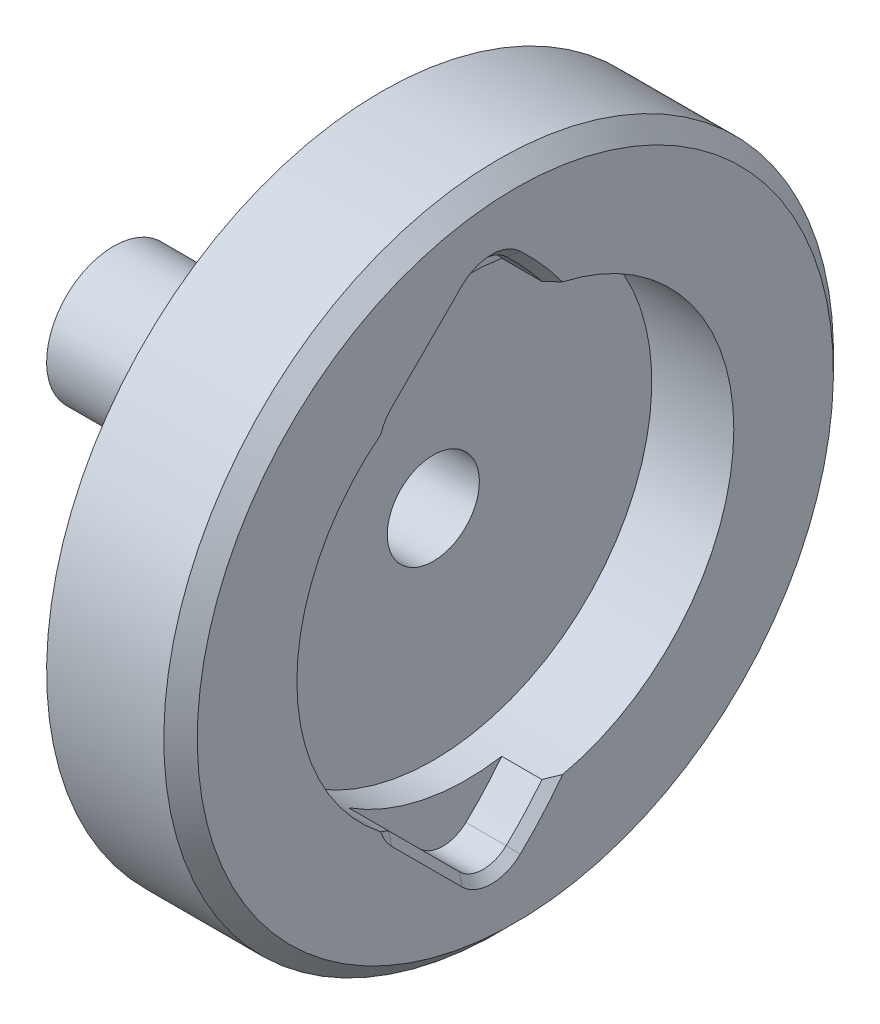
ISO-10303-21;
HEADER;
FILE_DESCRIPTION(('STEP AP214'),'2;1');
FILE_NAME('part.step','',(''),(''),'','','');
FILE_SCHEMA(('AUTOMOTIVE_DESIGN { 1 0 10303 214 1 1 1 1 }'));
ENDSEC;
DATA;
#1=APPLICATION_CONTEXT('core data for automotive mechanical design processes');
#2=APPLICATION_PROTOCOL_DEFINITION('international standard','automotive_design',2000,#1);
#3=PRODUCT_CONTEXT('',#1,'mechanical');
#4=PRODUCT('Part','Part','',(#3));
#5=PRODUCT_RELATED_PRODUCT_CATEGORY('part','',(#4));
#6=PRODUCT_DEFINITION_FORMATION('','',#4);
#7=PRODUCT_DEFINITION_CONTEXT('part definition',#1,'design');
#8=PRODUCT_DEFINITION('design','',#6,#7);
#9=PRODUCT_DEFINITION_SHAPE('','',#8);
#10=(LENGTH_UNIT() NAMED_UNIT(*) SI_UNIT(.MILLI.,.METRE.));
#11=(NAMED_UNIT(*) PLANE_ANGLE_UNIT() SI_UNIT($,.RADIAN.));
#12=(NAMED_UNIT(*) SI_UNIT($,.STERADIAN.) SOLID_ANGLE_UNIT());
#13=UNCERTAINTY_MEASURE_WITH_UNIT(LENGTH_MEASURE(1.E-05),#10,'distance_accuracy_value','');
#14=(GEOMETRIC_REPRESENTATION_CONTEXT(3) GLOBAL_UNCERTAINTY_ASSIGNED_CONTEXT((#13)) GLOBAL_UNIT_ASSIGNED_CONTEXT((#10,
#11,#12)) REPRESENTATION_CONTEXT('',''));
#15=CARTESIAN_POINT('',(0.,0.,0.));
#16=DIRECTION('',(0.,0.,1.));
#17=DIRECTION('',(1.,0.,0.));
#18=AXIS2_PLACEMENT_3D('',#15,#16,#17);
#19=CARTESIAN_POINT('',(5.1,0.,14.4333184705237));
#20=DIRECTION('',(1.,0.,0.));
#21=DIRECTION('',(0.,1.,0.));
#22=AXIS2_PLACEMENT_3D('',#19,#20,#21);
#23=CYLINDRICAL_SURFACE('',#22,20.95);
#24=CARTESIAN_POINT('',(5.1,0.,14.4333184705237));
#25=DIRECTION('',(1.,0.,0.));
#26=DIRECTION('',(0.,-1.,0.));
#27=AXIS2_PLACEMENT_3D('',#24,#25,#26);
#28=CIRCLE('',#27,20.95);
#29=CARTESIAN_POINT('',(5.1,12.8818445804651,-2.08820023099825));
#30=VERTEX_POINT('',#29);
#31=CARTESIAN_POINT('',(5.1,15.2342488146704,0.0520750245377594));
#32=VERTEX_POINT('',#31);
#33=EDGE_CURVE('E434',#30,#32,#28,.T.);
#34=ORIENTED_EDGE('',*,*,#33,.F.);
#35=DIRECTION('',(1.,0.,0.));
#36=VECTOR('',#35,1.);
#37=CARTESIAN_POINT('',(5.55,12.8818445804651,-2.08820023099825));
#38=LINE('',#37,#36);
#39=CARTESIAN_POINT('',(7.5,12.8818445804651,-2.08820023099825));
#40=VERTEX_POINT('',#39);
#41=EDGE_CURVE('E452',#30,#40,#38,.T.);
#42=ORIENTED_EDGE('',*,*,#41,.T.);
#43=CARTESIAN_POINT('',(7.50000000000001,0.,14.4333184705237));
#44=DIRECTION('',(1.,0.,0.));
#45=DIRECTION('',(0.,1.,0.));
#46=AXIS2_PLACEMENT_3D('',#43,#44,#45);
#47=CIRCLE('',#46,20.95);
#48=CARTESIAN_POINT('',(7.5,15.2342488146704,0.0520750245377594));
#49=VERTEX_POINT('',#48);
#50=EDGE_CURVE('E77',#40,#49,#47,.T.);
#51=ORIENTED_EDGE('',*,*,#50,.T.);
#52=DIRECTION('',(1.,0.,0.));
#53=VECTOR('',#52,1.);
#54=CARTESIAN_POINT('',(5.1,15.2342488146704,0.0520750245377594));
#55=LINE('',#54,#53);
#56=EDGE_CURVE('E393',#32,#49,#55,.T.);
#57=ORIENTED_EDGE('',*,*,#56,.F.);
#58=EDGE_LOOP('',(#34,#42,#51,#57));
#59=FACE_BOUND('',#58,.T.);
#60=ADVANCED_FACE('F49',(#59),#23,.F.);
#61=CARTESIAN_POINT('',(5.1,-13.7799052524107,1.42498609336697));
#62=DIRECTION('',(-1.,0.,0.));
#63=DIRECTION('',(0.,-1.,0.));
#64=AXIS2_PLACEMENT_3D('',#61,#62,#63);
#65=PLANE('',#64);
#66=CARTESIAN_POINT('',(5.1,9.57007567656878,5.63481566920882));
#67=DIRECTION('',(1.,0.,0.));
#68=DIRECTION('',(0.,-1.,0.));
#69=AXIS2_PLACEMENT_3D('',#66,#67,#68);
#70=CIRCLE('',#69,2.);
#71=CARTESIAN_POINT('',(5.1,10.9842892389419,7.04902923158192));
#72=VERTEX_POINT('',#71);
#73=CARTESIAN_POINT('',(5.1,10.9791166761917,7.05418294422313));
#74=VERTEX_POINT('',#73);
#75=EDGE_CURVE('E416',#72,#74,#70,.T.);
#76=ORIENTED_EDGE('',*,*,#75,.T.);
#77=CARTESIAN_POINT('',(5.1,0.,0.));
#78=DIRECTION('',(-1.,0.,0.));
#79=DIRECTION('',(0.,-1.,0.));
#80=AXIS2_PLACEMENT_3D('',#77,#78,#79);
#81=CIRCLE('',#80,13.05);
#82=EDGE_CURVE('E454',#74,#30,#81,.T.);
#83=ORIENTED_EDGE('',*,*,#82,.T.);
#84=ORIENTED_EDGE('',*,*,#33,.T.);
#85=CARTESIAN_POINT('',(5.1,13.7799052524107,1.42498609336697));
#86=DIRECTION('',(1.,0.,0.));
#87=DIRECTION('',(0.,1.,0.));
#88=AXIS2_PLACEMENT_3D('',#85,#86,#87);
#89=CIRCLE('',#88,2.);
#90=CARTESIAN_POINT('',(5.1,15.1941188147837,2.83919965574006));
#91=VERTEX_POINT('',#90);
#92=EDGE_CURVE('E426',#32,#91,#89,.T.);
#93=ORIENTED_EDGE('',*,*,#92,.T.);
#94=DIRECTION('',(0.,-0.707106781186549,0.707106781186546));
#95=VECTOR('',#94,1.);
#96=CARTESIAN_POINT('',(5.1,15.1941188147837,2.83919965574006));
#97=LINE('',#96,#95);
#98=EDGE_CURVE('E425',#91,#72,#97,.T.);
#99=ORIENTED_EDGE('',*,*,#98,.T.);
#100=EDGE_LOOP('',(#76,#83,#84,#93,#99));
#101=FACE_BOUND('',#100,.T.);
#102=ADVANCED_FACE('F312',(#101),#65,.F.);
#103=CARTESIAN_POINT('',(7.50000000000001,0.,14.4333184705237));
#104=DIRECTION('',(1.,0.,0.));
#105=DIRECTION('',(0.,1.,0.));
#106=AXIS2_PLACEMENT_3D('',#103,#104,#105);
#107=CONICAL_SURFACE('',#106,20.95,0.785398163397452);
#108=CARTESIAN_POINT('',(8.00019999999989,12.7410236271187,-2.82290930304251));
#109=CARTESIAN_POINT('',(7.91779692338126,12.7681402984375,-2.70042803403494));
#110=CARTESIAN_POINT('',(7.83489537836345,12.7934376363972,-2.57793744219343));
#111=CARTESIAN_POINT('',(7.66809537804651,12.8403936381337,-2.33293765179135));
#112=CARTESIAN_POINT('',(7.58419692306435,12.8620523030674,-2.2104284532367));
#113=CARTESIAN_POINT('',(7.4998,12.8818916357989,-2.08790993185405));
#114=B_SPLINE_CURVE_WITH_KNOTS('',3,(#108,#109,#110,#111,#112,#113),.UNSPECIFIED.,.F.,.F.,(4,2,
4),(0.,0.450165635155379,0.900331127180728),.UNSPECIFIED.);
#115=CARTESIAN_POINT('',(8.,12.7410894780223,-2.8226120727136));
#116=VERTEX_POINT('',#115);
#117=EDGE_CURVE('E444',#116,#40,#114,.T.);
#118=ORIENTED_EDGE('',*,*,#117,.F.);
#119=CARTESIAN_POINT('',(8.,0.,14.4333184705237));
#120=DIRECTION('',(1.,0.,0.));
#121=DIRECTION('',(0.,1.,0.));
#122=AXIS2_PLACEMENT_3D('',#119,#120,#121);
#123=CIRCLE('',#122,21.45);
#124=CARTESIAN_POINT('',(8.,15.5978347052353,-0.291152742669542));
#125=VERTEX_POINT('',#124);
#126=EDGE_CURVE('E358',#125,#116,#123,.F.);
#127=ORIENTED_EDGE('',*,*,#126,.F.);
#128=DIRECTION('',(0.707106781186545,0.514188097524421,-0.485397363367602));
#129=VECTOR('',#128,1.);
#130=CARTESIAN_POINT('',(7.5,15.2342488146704,0.05207502453776));
#131=LINE('',#130,#129);
#132=EDGE_CURVE('E240',#49,#125,#131,.T.);
#133=ORIENTED_EDGE('',*,*,#132,.F.);
#134=ORIENTED_EDGE('',*,*,#50,.F.);
#135=EDGE_LOOP('',(#118,#127,#133,#134));
#136=FACE_BOUND('',#135,.T.);
#137=ADVANCED_FACE('F311',(#136),#107,.F.);
#138=CARTESIAN_POINT('',(-16.,0.,0.));
#139=DIRECTION('',(-1.,0.,0.));
#140=DIRECTION('',(0.,-1.,0.));
#141=AXIS2_PLACEMENT_3D('',#138,#139,#140);
#142=PLANE('',#141);
#143=CARTESIAN_POINT('',(-16.,0.,0.));
#144=DIRECTION('',(-1.,0.,0.));
#145=DIRECTION('',(0.,-1.,0.));
#146=AXIS2_PLACEMENT_3D('',#143,#144,#145);
#147=CIRCLE('',#146,1.75);
#148=CARTESIAN_POINT('',(-16.,-1.75,0.));
#149=VERTEX_POINT('',#148);
#150=EDGE_CURVE('E376',#149,#149,#147,.T.);
#151=ORIENTED_EDGE('',*,*,#150,.F.);
#152=EDGE_LOOP('',(#151));
#153=FACE_BOUND('',#152,.T.);
#154=CARTESIAN_POINT('',(-16.,0.,0.));
#155=DIRECTION('',(1.,0.,0.));
#156=DIRECTION('',(0.,1.,0.));
#157=AXIS2_PLACEMENT_3D('',#154,#155,#156);
#158=CIRCLE('',#157,4.);
#159=CARTESIAN_POINT('',(-16.,4.,0.));
#160=VERTEX_POINT('',#159);
#161=EDGE_CURVE('E381',#160,#160,#158,.T.);
#162=ORIENTED_EDGE('',*,*,#161,.F.);
#163=EDGE_LOOP('',(#162));
#164=FACE_BOUND('',#163,.T.);
#165=ADVANCED_FACE('F531',(#153,#164),#142,.T.);
#166=CARTESIAN_POINT('',(8.,0.,0.));
#167=DIRECTION('',(1.,0.,0.));
#168=DIRECTION('',(0.,1.,0.));
#169=AXIS2_PLACEMENT_3D('',#166,#167,#168);
#170=CYLINDRICAL_SURFACE('',#169,4.);
#171=CARTESIAN_POINT('',(-10.,0.,0.));
#172=DIRECTION('',(-1.,0.,0.));
#173=DIRECTION('',(0.,-1.,0.));
#174=AXIS2_PLACEMENT_3D('',#171,#172,#173);
#175=CIRCLE('',#174,4.);
#176=CARTESIAN_POINT('',(-10.,-4.,0.));
#177=VERTEX_POINT('',#176);
#178=EDGE_CURVE('E371',#177,#177,#175,.T.);
#179=ORIENTED_EDGE('',*,*,#178,.T.);
#180=EDGE_LOOP('',(#179));
#181=FACE_BOUND('',#180,.T.);
#182=ORIENTED_EDGE('',*,*,#161,.T.);
#183=EDGE_LOOP('',(#182));
#184=FACE_BOUND('',#183,.T.);
#185=ADVANCED_FACE('F537',(#181,#184),#170,.T.);
#186=CARTESIAN_POINT('',(0.,4.,0.));
#187=DIRECTION('',(-1.,0.,0.));
#188=DIRECTION('',(0.,-1.,0.));
#189=AXIS2_PLACEMENT_3D('',#186,#187,#188);
#190=PLANE('',#189);
#191=CARTESIAN_POINT('',(0.,0.,0.));
#192=DIRECTION('',(-1.,0.,0.));
#193=DIRECTION('',(0.,-1.,0.));
#194=AXIS2_PLACEMENT_3D('',#191,#192,#193);
#195=CIRCLE('',#194,14.);
#196=CARTESIAN_POINT('',(0.,-14.,0.));
#197=VERTEX_POINT('',#196);
#198=EDGE_CURVE('E379',#197,#197,#195,.F.);
#199=ORIENTED_EDGE('',*,*,#198,.T.);
#200=EDGE_LOOP('',(#199));
#201=FACE_BOUND('',#200,.T.);
#202=CARTESIAN_POINT('',(0.,0.,0.));
#203=DIRECTION('',(1.,0.,0.));
#204=DIRECTION('',(0.,1.,0.));
#205=AXIS2_PLACEMENT_3D('',#202,#203,#204);
#206=CIRCLE('',#205,20.);
#207=CARTESIAN_POINT('',(0.,20.,0.));
#208=VERTEX_POINT('',#207);
#209=EDGE_CURVE('E389',#208,#208,#206,.T.);
#210=ORIENTED_EDGE('',*,*,#209,.F.);
#211=EDGE_LOOP('',(#210));
#212=FACE_BOUND('',#211,.T.);
#213=ADVANCED_FACE('F542',(#201,#212),#190,.T.);
#214=CARTESIAN_POINT('',(8.,0.,0.));
#215=DIRECTION('',(1.,0.,0.));
#216=DIRECTION('',(0.,1.,0.));
#217=AXIS2_PLACEMENT_3D('',#214,#215,#216);
#218=CYLINDRICAL_SURFACE('',#217,20.);
#219=CARTESIAN_POINT('',(7.00000000000004,0.,0.));
#220=DIRECTION('',(1.,0.,0.));
#221=DIRECTION('',(0.,1.,0.));
#222=AXIS2_PLACEMENT_3D('',#219,#220,#221);
#223=CIRCLE('',#222,20.);
#224=CARTESIAN_POINT('',(7.00000000000003,20.,0.));
#225=VERTEX_POINT('',#224);
#226=EDGE_CURVE('E361',#225,#225,#223,.F.);
#227=ORIENTED_EDGE('',*,*,#226,.T.);
#228=EDGE_LOOP('',(#227));
#229=FACE_BOUND('',#228,.T.);
#230=ORIENTED_EDGE('',*,*,#209,.T.);
#231=EDGE_LOOP('',(#230));
#232=FACE_BOUND('',#231,.T.);
#233=ADVANCED_FACE('F549',(#229,#232),#218,.T.);
#234=CARTESIAN_POINT('',(8.,20.,0.));
#235=DIRECTION('',(1.,0.,0.));
#236=DIRECTION('',(0.,1.,0.));
#237=AXIS2_PLACEMENT_3D('',#234,#235,#236);
#238=PLANE('',#237);
#239=CARTESIAN_POINT('',(8.,0.,0.));
#240=DIRECTION('',(1.,0.,0.));
#241=DIRECTION('',(0.,1.,0.));
#242=AXIS2_PLACEMENT_3D('',#239,#240,#241);
#243=CIRCLE('',#242,13.05);
#244=CARTESIAN_POINT('',(8.,10.2871401538683,8.02977256556316));
#245=VERTEX_POINT('',#244);
#246=CARTESIAN_POINT('',(8.,-10.2871401538683,8.02977256556316));
#247=VERTEX_POINT('',#246);
#248=EDGE_CURVE('E70',#245,#247,#243,.T.);
#249=ORIENTED_EDGE('',*,*,#248,.F.);
#250=CARTESIAN_POINT('',(8.,9.57007567656878,5.63481566920882));
#251=DIRECTION('',(1.,0.,0.));
#252=DIRECTION('',(0.,1.,0.));
#253=AXIS2_PLACEMENT_3D('',#250,#251,#252);
#254=CIRCLE('',#253,2.5);
#255=CARTESIAN_POINT('',(8.,11.3378426295351,7.4025826221752));
#256=VERTEX_POINT('',#255);
#257=EDGE_CURVE('E176',#245,#256,#254,.F.);
#258=ORIENTED_EDGE('',*,*,#257,.T.);
#259=DIRECTION('',(0.,0.707106781186549,-0.707106781186546));
#260=VECTOR('',#259,1.);
#261=CARTESIAN_POINT('',(8.,15.547672205377,3.19275304633334));
#262=LINE('',#261,#260);
#263=CARTESIAN_POINT('',(8.,15.547672205377,3.19275304633334));
#264=VERTEX_POINT('',#263);
#265=EDGE_CURVE('E193',#256,#264,#262,.T.);
#266=ORIENTED_EDGE('',*,*,#265,.T.);
#267=CARTESIAN_POINT('',(8.,13.7799052524107,1.42498609336697));
#268=DIRECTION('',(1.,0.,0.));
#269=DIRECTION('',(0.,1.,0.));
#270=AXIS2_PLACEMENT_3D('',#267,#268,#269);
#271=CIRCLE('',#270,2.5);
#272=EDGE_CURVE('E354',#264,#125,#271,.F.);
#273=ORIENTED_EDGE('',*,*,#272,.T.);
#274=ORIENTED_EDGE('',*,*,#126,.T.);
#275=CARTESIAN_POINT('',(8.,-12.7410894780224,-2.8226120727135));
#276=VERTEX_POINT('',#275);
#277=EDGE_CURVE('E185',#276,#116,#243,.T.);
#278=ORIENTED_EDGE('',*,*,#277,.F.);
#279=CARTESIAN_POINT('',(8.,-15.5978347052353,-0.291152742669548));
#280=VERTEX_POINT('',#279);
#281=EDGE_CURVE('E365',#276,#280,#123,.F.);
#282=ORIENTED_EDGE('',*,*,#281,.T.);
#283=CARTESIAN_POINT('',(8.,-13.7799052524107,1.42498609336697));
#284=DIRECTION('',(1.,0.,0.));
#285=DIRECTION('',(0.,1.,0.));
#286=AXIS2_PLACEMENT_3D('',#283,#284,#285);
#287=CIRCLE('',#286,2.5);
#288=CARTESIAN_POINT('',(8.,-15.547672205377,3.19275304633334));
#289=VERTEX_POINT('',#288);
#290=EDGE_CURVE('E346',#280,#289,#287,.F.);
#291=ORIENTED_EDGE('',*,*,#290,.T.);
#292=DIRECTION('',(0.,0.707106781186549,0.707106781186546));
#293=VECTOR('',#292,1.);
#294=CARTESIAN_POINT('',(8.,-11.3378426295351,7.40258262217519));
#295=LINE('',#294,#293);
#296=CARTESIAN_POINT('',(8.,-11.3378426295351,7.40258262217519));
#297=VERTEX_POINT('',#296);
#298=EDGE_CURVE('E186',#289,#297,#295,.T.);
#299=ORIENTED_EDGE('',*,*,#298,.T.);
#300=CARTESIAN_POINT('',(8.,-9.57007567656878,5.63481566920882));
#301=DIRECTION('',(1.,0.,0.));
#302=DIRECTION('',(0.,1.,0.));
#303=AXIS2_PLACEMENT_3D('',#300,#301,#302);
#304=CIRCLE('',#303,2.5);
#305=EDGE_CURVE('E177',#297,#247,#304,.F.);
#306=ORIENTED_EDGE('',*,*,#305,.T.);
#307=EDGE_LOOP('',(#249,#258,#266,#273,#274,#278,#282,#291,#299,#306));
#308=FACE_BOUND('',#307,.T.);
#309=CARTESIAN_POINT('',(8.,0.,0.));
#310=DIRECTION('',(1.,0.,0.));
#311=DIRECTION('',(0.,1.,0.));
#312=AXIS2_PLACEMENT_3D('',#309,#310,#311);
#313=CIRCLE('',#312,19.);
#314=CARTESIAN_POINT('',(8.,19.,0.));
#315=VERTEX_POINT('',#314);
#316=EDGE_CURVE('E370',#315,#315,#313,.T.);
#317=ORIENTED_EDGE('',*,*,#316,.T.);
#318=EDGE_LOOP('',(#317));
#319=FACE_BOUND('',#318,.T.);
#320=ADVANCED_FACE('F172',(#308,#319),#238,.T.);
#321=CARTESIAN_POINT('',(5.1,-13.7799052524107,1.42498609336697));
#322=DIRECTION('',(1.,0.,0.));
#323=DIRECTION('',(0.,1.,0.));
#324=AXIS2_PLACEMENT_3D('',#321,#322,#323);
#325=CYLINDRICAL_SURFACE('',#324,2.);
#326=DIRECTION('',(1.,0.,0.));
#327=VECTOR('',#326,1.);
#328=CARTESIAN_POINT('',(5.1,-15.1941188147837,2.83919965574006));
#329=LINE('',#328,#327);
#330=CARTESIAN_POINT('',(5.1,-15.1941188147837,2.83919965574006));
#331=VERTEX_POINT('',#330);
#332=CARTESIAN_POINT('',(7.50000000000001,-15.1941188147837,2.83919965574006));
#333=VERTEX_POINT('',#332);
#334=EDGE_CURVE('E394',#331,#333,#329,.T.);
#335=ORIENTED_EDGE('',*,*,#334,.T.);
#336=CARTESIAN_POINT('',(7.50000000000001,-13.7799052524107,1.42498609336697));
#337=DIRECTION('',(1.,0.,0.));
#338=DIRECTION('',(0.,0.,-1.));
#339=AXIS2_PLACEMENT_3D('',#336,#337,#338);
#340=CIRCLE('',#339,2.);
#341=CARTESIAN_POINT('',(7.50000000000001,-15.2342488146704,0.0520750245377542));
#342=VERTEX_POINT('',#341);
#343=EDGE_CURVE('E208',#333,#342,#340,.T.);
#344=ORIENTED_EDGE('',*,*,#343,.T.);
#345=DIRECTION('',(1.,0.,0.));
#346=VECTOR('',#345,1.);
#347=CARTESIAN_POINT('',(5.1,-15.2342488146704,0.0520750245377542));
#348=LINE('',#347,#346);
#349=CARTESIAN_POINT('',(5.1,-15.2342488146704,0.0520750245377542));
#350=VERTEX_POINT('',#349);
#351=EDGE_CURVE('E345',#350,#342,#348,.T.);
#352=ORIENTED_EDGE('',*,*,#351,.F.);
#353=CARTESIAN_POINT('',(5.1,-13.7799052524107,1.42498609336697));
#354=DIRECTION('',(1.,0.,0.));
#355=DIRECTION('',(0.,-1.,0.));
#356=AXIS2_PLACEMENT_3D('',#353,#354,#355);
#357=CIRCLE('',#356,2.);
#358=EDGE_CURVE('E436',#331,#350,#357,.T.);
#359=ORIENTED_EDGE('',*,*,#358,.F.);
#360=EDGE_LOOP('',(#335,#344,#352,#359));
#361=FACE_BOUND('',#360,.T.);
#362=ADVANCED_FACE('F509',(#361),#325,.F.);
#363=CARTESIAN_POINT('',(5.1,-10.9842892389419,7.04902923158192));
#364=DIRECTION('',(0.,-0.707106781186546,0.707106781186549));
#365=DIRECTION('',(0.,-0.707106781186549,-0.707106781186546));
#366=AXIS2_PLACEMENT_3D('',#363,#364,#365);
#367=PLANE('',#366);
#368=DIRECTION('',(1.,0.,0.));
#369=VECTOR('',#368,1.);
#370=CARTESIAN_POINT('',(5.1,-10.9842892389419,7.04902923158192));
#371=LINE('',#370,#369);
#372=CARTESIAN_POINT('',(5.1,-10.9842892389419,7.04902923158192));
#373=VERTEX_POINT('',#372);
#374=CARTESIAN_POINT('',(7.50000000000001,-10.9842892389419,7.04902923158192));
#375=VERTEX_POINT('',#374);
#376=EDGE_CURVE('E410',#373,#375,#371,.T.);
#377=ORIENTED_EDGE('',*,*,#376,.T.);
#378=DIRECTION('',(0.,-0.707106781186549,-0.707106781186546));
#379=VECTOR('',#378,1.);
#380=CARTESIAN_POINT('',(7.50000000000001,-15.1941188147837,2.83919965574006));
#381=LINE('',#380,#379);
#382=EDGE_CURVE('E205',#375,#333,#381,.T.);
#383=ORIENTED_EDGE('',*,*,#382,.T.);
#384=ORIENTED_EDGE('',*,*,#334,.F.);
#385=DIRECTION('',(0.,-0.707106781186549,-0.707106781186546));
#386=VECTOR('',#385,1.);
#387=CARTESIAN_POINT('',(5.1,-10.9842892389419,7.04902923158192));
#388=LINE('',#387,#386);
#389=EDGE_CURVE('E398',#373,#331,#388,.T.);
#390=ORIENTED_EDGE('',*,*,#389,.F.);
#391=EDGE_LOOP('',(#377,#383,#384,#390));
#392=FACE_BOUND('',#391,.T.);
#393=ADVANCED_FACE('F506',(#392),#367,.F.);
#394=CARTESIAN_POINT('',(5.1,-9.57007567656878,5.63481566920882));
#395=DIRECTION('',(1.,0.,0.));
#396=DIRECTION('',(0.,1.,0.));
#397=AXIS2_PLACEMENT_3D('',#394,#395,#396);
#398=CYLINDRICAL_SURFACE('',#397,2.);
#399=CARTESIAN_POINT('',(5.1,-9.57007567656878,5.63481566920882));
#400=DIRECTION('',(1.,0.,0.));
#401=DIRECTION('',(0.,1.,0.));
#402=AXIS2_PLACEMENT_3D('',#399,#400,#401);
#403=CIRCLE('',#402,2.);
#404=CARTESIAN_POINT('',(5.1,-10.9791166761917,7.05418294422313));
#405=VERTEX_POINT('',#404);
#406=EDGE_CURVE('E419',#405,#373,#403,.T.);
#407=ORIENTED_EDGE('',*,*,#406,.F.);
#408=DIRECTION('',(1.,0.,0.));
#409=VECTOR('',#408,1.);
#410=CARTESIAN_POINT('',(5.55000000000001,-10.9791166761917,7.05418294422313));
#411=LINE('',#410,#409);
#412=CARTESIAN_POINT('',(7.50000000000001,-10.9791166761917,7.05418294422315));
#413=VERTEX_POINT('',#412);
#414=EDGE_CURVE('E464',#405,#413,#411,.T.);
#415=ORIENTED_EDGE('',*,*,#414,.T.);
#416=CARTESIAN_POINT('',(7.50000000000001,-9.57007567656878,5.63481566920882));
#417=DIRECTION('',(1.,0.,0.));
#418=DIRECTION('',(0.,0.,-1.));
#419=AXIS2_PLACEMENT_3D('',#416,#417,#418);
#420=CIRCLE('',#419,2.);
#421=EDGE_CURVE('E194',#413,#375,#420,.T.);
#422=ORIENTED_EDGE('',*,*,#421,.T.);
#423=ORIENTED_EDGE('',*,*,#376,.F.);
#424=EDGE_LOOP('',(#407,#415,#422,#423));
#425=FACE_BOUND('',#424,.T.);
#426=ADVANCED_FACE('F497',(#425),#398,.F.);
#427=CARTESIAN_POINT('',(5.1,9.57007567656878,5.63481566920882));
#428=DIRECTION('',(1.,0.,0.));
#429=DIRECTION('',(0.,1.,0.));
#430=AXIS2_PLACEMENT_3D('',#427,#428,#429);
#431=CYLINDRICAL_SURFACE('',#430,2.);
#432=CARTESIAN_POINT('',(7.5,9.57007567656878,5.63481566920882));
#433=DIRECTION('',(1.,0.,0.));
#434=DIRECTION('',(0.,0.,-1.));
#435=AXIS2_PLACEMENT_3D('',#432,#433,#434);
#436=CIRCLE('',#435,2.);
#437=CARTESIAN_POINT('',(7.5,10.9842892389419,7.04902923158192));
#438=VERTEX_POINT('',#437);
#439=CARTESIAN_POINT('',(7.50000000000001,10.9791166761917,7.05418294422315));
#440=VERTEX_POINT('',#439);
#441=EDGE_CURVE('E203',#438,#440,#436,.T.);
#442=ORIENTED_EDGE('',*,*,#441,.T.);
#443=DIRECTION('',(1.,0.,0.));
#444=VECTOR('',#443,1.);
#445=CARTESIAN_POINT('',(5.55,10.9791166761917,7.05418294422313));
#446=LINE('',#445,#444);
#447=EDGE_CURVE('E165',#440,#74,#446,.F.);
#448=ORIENTED_EDGE('',*,*,#447,.T.);
#449=ORIENTED_EDGE('',*,*,#75,.F.);
#450=DIRECTION('',(1.,0.,0.));
#451=VECTOR('',#450,1.);
#452=CARTESIAN_POINT('',(5.1,10.9842892389419,7.04902923158192));
#453=LINE('',#452,#451);
#454=EDGE_CURVE('E401',#72,#438,#453,.T.);
#455=ORIENTED_EDGE('',*,*,#454,.T.);
#456=EDGE_LOOP('',(#442,#448,#449,#455));
#457=FACE_BOUND('',#456,.T.);
#458=ADVANCED_FACE('F498',(#457),#431,.F.);
#459=CARTESIAN_POINT('',(5.1,15.1941188147837,2.83919965574006));
#460=DIRECTION('',(0.,0.707106781186546,0.707106781186549));
#461=DIRECTION('',(0.,-0.707106781186549,0.707106781186546));
#462=AXIS2_PLACEMENT_3D('',#459,#460,#461);
#463=PLANE('',#462);
#464=DIRECTION('',(1.,0.,0.));
#465=VECTOR('',#464,1.);
#466=CARTESIAN_POINT('',(5.1,15.1941188147837,2.83919965574006));
#467=LINE('',#466,#465);
#468=CARTESIAN_POINT('',(7.5,15.1941188147837,2.83919965574006));
#469=VERTEX_POINT('',#468);
#470=EDGE_CURVE('E400',#91,#469,#467,.T.);
#471=ORIENTED_EDGE('',*,*,#470,.T.);
#472=DIRECTION('',(0.,-0.707106781186549,0.707106781186546));
#473=VECTOR('',#472,1.);
#474=CARTESIAN_POINT('',(7.5,10.9842892389419,7.04902923158192));
#475=LINE('',#474,#473);
#476=EDGE_CURVE('E210',#469,#438,#475,.T.);
#477=ORIENTED_EDGE('',*,*,#476,.T.);
#478=ORIENTED_EDGE('',*,*,#454,.F.);
#479=ORIENTED_EDGE('',*,*,#98,.F.);
#480=EDGE_LOOP('',(#471,#477,#478,#479));
#481=FACE_BOUND('',#480,.T.);
#482=ADVANCED_FACE('F335',(#481),#463,.F.);
#483=CARTESIAN_POINT('',(5.1,13.7799052524107,1.42498609336697));
#484=DIRECTION('',(1.,0.,0.));
#485=DIRECTION('',(0.,1.,0.));
#486=AXIS2_PLACEMENT_3D('',#483,#484,#485);
#487=CYLINDRICAL_SURFACE('',#486,2.);
#488=ORIENTED_EDGE('',*,*,#56,.T.);
#489=CARTESIAN_POINT('',(7.5,13.7799052524107,1.42498609336697));
#490=DIRECTION('',(1.,0.,0.));
#491=DIRECTION('',(0.,0.,-1.));
#492=AXIS2_PLACEMENT_3D('',#489,#490,#491);
#493=CIRCLE('',#492,2.);
#494=EDGE_CURVE('E214',#49,#469,#493,.T.);
#495=ORIENTED_EDGE('',*,*,#494,.T.);
#496=ORIENTED_EDGE('',*,*,#470,.F.);
#497=ORIENTED_EDGE('',*,*,#92,.F.);
#498=EDGE_LOOP('',(#488,#495,#496,#497));
#499=FACE_BOUND('',#498,.T.);
#500=ADVANCED_FACE('F327',(#499),#487,.F.);
#501=CARTESIAN_POINT('',(7.50000000000001,-12.8818445804651,-2.08820023099825));
#502=VERTEX_POINT('',#501);
#503=EDGE_CURVE('E65',#342,#502,#47,.T.);
#504=ORIENTED_EDGE('',*,*,#503,.T.);
#505=DIRECTION('',(1.,0.,0.));
#506=VECTOR('',#505,1.);
#507=CARTESIAN_POINT('',(5.55000000000001,-12.8818445804651,-2.08820023099825));
#508=LINE('',#507,#506);
#509=CARTESIAN_POINT('',(5.1,-12.8818445804651,-2.08820023099825));
#510=VERTEX_POINT('',#509);
#511=EDGE_CURVE('E338',#502,#510,#508,.F.);
#512=ORIENTED_EDGE('',*,*,#511,.T.);
#513=EDGE_CURVE('E435',#350,#510,#28,.T.);
#514=ORIENTED_EDGE('',*,*,#513,.F.);
#515=ORIENTED_EDGE('',*,*,#351,.T.);
#516=EDGE_LOOP('',(#504,#512,#514,#515));
#517=FACE_BOUND('',#516,.T.);
#518=ADVANCED_FACE('F314',(#517),#23,.F.);
#519=ORIENTED_EDGE('',*,*,#513,.T.);
#520=EDGE_CURVE('E459',#510,#405,#81,.T.);
#521=ORIENTED_EDGE('',*,*,#520,.T.);
#522=ORIENTED_EDGE('',*,*,#406,.T.);
#523=ORIENTED_EDGE('',*,*,#389,.T.);
#524=ORIENTED_EDGE('',*,*,#358,.T.);
#525=EDGE_LOOP('',(#519,#521,#522,#523,#524));
#526=FACE_BOUND('',#525,.T.);
#527=ADVANCED_FACE('F322',(#526),#65,.F.);
#528=CARTESIAN_POINT('',(-10.,0.,0.));
#529=DIRECTION('',(-1.,0.,0.));
#530=DIRECTION('',(0.,-1.,0.));
#531=AXIS2_PLACEMENT_3D('',#528,#529,#530);
#532=TOROIDAL_SURFACE('',#531,14.,10.);
#533=ORIENTED_EDGE('',*,*,#178,.F.);
#534=EDGE_LOOP('',(#533));
#535=FACE_BOUND('',#534,.T.);
#536=ORIENTED_EDGE('',*,*,#198,.F.);
#537=EDGE_LOOP('',(#536));
#538=FACE_BOUND('',#537,.T.);
#539=ADVANCED_FACE('F334',(#535,#538),#532,.F.);
#540=CARTESIAN_POINT('',(8.001,0.,0.));
#541=DIRECTION('',(-1.,0.,0.));
#542=DIRECTION('',(0.,-1.,0.));
#543=AXIS2_PLACEMENT_3D('',#540,#541,#542);
#544=CYLINDRICAL_SURFACE('',#543,1.75);
#545=CARTESIAN_POINT('',(-13.,0.,0.));
#546=DIRECTION('',(-1.,0.,0.));
#547=DIRECTION('',(0.,-1.,0.));
#548=AXIS2_PLACEMENT_3D('',#545,#546,#547);
#549=CIRCLE('',#548,1.75);
#550=CARTESIAN_POINT('',(-13.,-1.75,0.));
#551=VERTEX_POINT('',#550);
#552=EDGE_CURVE('E375',#551,#551,#549,.F.);
#553=ORIENTED_EDGE('',*,*,#552,.T.);
#554=EDGE_LOOP('',(#553));
#555=FACE_BOUND('',#554,.T.);
#556=ORIENTED_EDGE('',*,*,#150,.T.);
#557=EDGE_LOOP('',(#556));
#558=FACE_BOUND('',#557,.T.);
#559=ADVANCED_FACE('F514',(#555,#558),#544,.F.);
#560=CARTESIAN_POINT('',(-13.,0.,0.));
#561=DIRECTION('',(-1.,0.,0.));
#562=DIRECTION('',(0.,-1.,0.));
#563=AXIS2_PLACEMENT_3D('',#560,#561,#562);
#564=PLANE('',#563);
#565=CARTESIAN_POINT('',(-13.,0.,0.));
#566=DIRECTION('',(-1.,0.,0.));
#567=DIRECTION('',(0.,-1.,0.));
#568=AXIS2_PLACEMENT_3D('',#565,#566,#567);
#569=CIRCLE('',#568,2.75);
#570=CARTESIAN_POINT('',(-13.,-2.75,0.));
#571=VERTEX_POINT('',#570);
#572=EDGE_CURVE('E239',#571,#571,#569,.F.);
#573=ORIENTED_EDGE('',*,*,#572,.T.);
#574=EDGE_LOOP('',(#573));
#575=FACE_BOUND('',#574,.T.);
#576=ORIENTED_EDGE('',*,*,#552,.F.);
#577=EDGE_LOOP('',(#576));
#578=FACE_BOUND('',#577,.T.);
#579=ADVANCED_FACE('F517',(#575,#578),#564,.F.);
#580=CARTESIAN_POINT('',(-23.778174593052,0.,0.));
#581=DIRECTION('',(1.,0.,0.));
#582=DIRECTION('',(0.,1.,0.));
#583=AXIS2_PLACEMENT_3D('',#580,#581,#582);
#584=CYLINDRICAL_SURFACE('',#583,2.75);
#585=CARTESIAN_POINT('',(3.10000000000001,0.,0.));
#586=DIRECTION('',(-1.,0.,0.));
#587=DIRECTION('',(0.,-1.,0.));
#588=AXIS2_PLACEMENT_3D('',#585,#586,#587);
#589=CIRCLE('',#588,2.75);
#590=CARTESIAN_POINT('',(3.10000000000001,-2.75,0.));
#591=VERTEX_POINT('',#590);
#592=EDGE_CURVE('E57',#591,#591,#589,.F.);
#593=ORIENTED_EDGE('',*,*,#592,.T.);
#594=EDGE_LOOP('',(#593));
#595=FACE_BOUND('',#594,.T.);
#596=ORIENTED_EDGE('',*,*,#572,.F.);
#597=EDGE_LOOP('',(#596));
#598=FACE_BOUND('',#597,.T.);
#599=ADVANCED_FACE('F516',(#595,#598),#584,.F.);
#600=CARTESIAN_POINT('',(8.,0.,0.));
#601=DIRECTION('',(-1.,0.,0.));
#602=DIRECTION('',(0.,-1.,0.));
#603=AXIS2_PLACEMENT_3D('',#600,#601,#602);
#604=CONICAL_SURFACE('',#603,19.,0.785398163397448);
#605=ORIENTED_EDGE('',*,*,#226,.F.);
#606=EDGE_LOOP('',(#605));
#607=FACE_BOUND('',#606,.T.);
#608=ORIENTED_EDGE('',*,*,#316,.F.);
#609=EDGE_LOOP('',(#608));
#610=FACE_BOUND('',#609,.T.);
#611=ADVANCED_FACE('F307',(#607,#610),#604,.T.);
#612=CARTESIAN_POINT('',(7.4998,-12.8818916357989,-2.08790993185405));
#613=CARTESIAN_POINT('',(7.58419692306435,-12.8620523030674,-2.2104284532367));
#614=CARTESIAN_POINT('',(7.66809537804651,-12.8403936381337,-2.33293765179134));
#615=CARTESIAN_POINT('',(7.83489537836345,-12.7934376363972,-2.57793744219342));
#616=CARTESIAN_POINT('',(7.91779692338126,-12.7681402984375,-2.70042803403493));
#617=CARTESIAN_POINT('',(8.00019999999989,-12.7410236271187,-2.82290930304251));
#618=B_SPLINE_CURVE_WITH_KNOTS('',3,(#612,#613,#614,#615,#616,#617),.UNSPECIFIED.,.F.,.F.,(4,2,
4),(0.,0.450165492025351,0.900331127180731),.UNSPECIFIED.);
#619=EDGE_CURVE('E167',#502,#276,#618,.T.);
#620=ORIENTED_EDGE('',*,*,#619,.F.);
#621=ORIENTED_EDGE('',*,*,#503,.F.);
#622=DIRECTION('',(-0.707106781186545,0.514188097524419,0.485397363367604));
#623=VECTOR('',#622,1.);
#624=CARTESIAN_POINT('',(8.,-15.5978347052353,-0.291152742669548));
#625=LINE('',#624,#623);
#626=EDGE_CURVE('E231',#280,#342,#625,.T.);
#627=ORIENTED_EDGE('',*,*,#626,.F.);
#628=ORIENTED_EDGE('',*,*,#281,.F.);
#629=EDGE_LOOP('',(#620,#621,#627,#628));
#630=FACE_BOUND('',#629,.T.);
#631=ADVANCED_FACE('F52',(#630),#107,.F.);
#632=CARTESIAN_POINT('',(7.5,13.7799052524107,1.42498609336697));
#633=DIRECTION('',(1.,0.,0.));
#634=DIRECTION('',(0.,0.,-1.));
#635=AXIS2_PLACEMENT_3D('',#632,#633,#634);
#636=CONICAL_SURFACE('',#635,2.,0.785398163397452);
#637=ORIENTED_EDGE('',*,*,#132,.T.);
#638=ORIENTED_EDGE('',*,*,#272,.F.);
#639=DIRECTION('',(0.707106781186545,0.500000000000002,0.500000000000002));
#640=VECTOR('',#639,1.);
#641=CARTESIAN_POINT('',(7.5,15.1941188147837,2.83919965574006));
#642=LINE('',#641,#640);
#643=EDGE_CURVE('E230',#469,#264,#642,.T.);
#644=ORIENTED_EDGE('',*,*,#643,.F.);
#645=ORIENTED_EDGE('',*,*,#494,.F.);
#646=EDGE_LOOP('',(#637,#638,#644,#645));
#647=FACE_BOUND('',#646,.T.);
#648=ADVANCED_FACE('F299',(#647),#636,.F.);
#649=CARTESIAN_POINT('',(7.50000000000001,-13.7799052524107,1.42498609336697));
#650=DIRECTION('',(1.,0.,0.));
#651=DIRECTION('',(0.,0.,-1.));
#652=AXIS2_PLACEMENT_3D('',#649,#650,#651);
#653=CONICAL_SURFACE('',#652,2.,0.785398163397452);
#654=ORIENTED_EDGE('',*,*,#626,.T.);
#655=ORIENTED_EDGE('',*,*,#343,.F.);
#656=DIRECTION('',(-0.707106781186545,0.500000000000002,-0.500000000000002));
#657=VECTOR('',#656,1.);
#658=CARTESIAN_POINT('',(8.,-15.547672205377,3.19275304633334));
#659=LINE('',#658,#657);
#660=EDGE_CURVE('E221',#289,#333,#659,.T.);
#661=ORIENTED_EDGE('',*,*,#660,.F.);
#662=ORIENTED_EDGE('',*,*,#290,.F.);
#663=EDGE_LOOP('',(#654,#655,#661,#662));
#664=FACE_BOUND('',#663,.T.);
#665=ADVANCED_FACE('F291',(#664),#653,.F.);
#666=CARTESIAN_POINT('',(7.5,15.1941188147837,2.83919965574006));
#667=DIRECTION('',(0.707106781186551,-0.499999999999997,-0.499999999999998));
#668=DIRECTION('',(0.,0.707106781186549,-0.707106781186546));
#669=AXIS2_PLACEMENT_3D('',#666,#667,#668);
#670=PLANE('',#669);
#671=ORIENTED_EDGE('',*,*,#643,.T.);
#672=ORIENTED_EDGE('',*,*,#265,.F.);
#673=DIRECTION('',(0.707106781186545,0.5,0.500000000000003));
#674=VECTOR('',#673,1.);
#675=CARTESIAN_POINT('',(7.5,10.9842892389419,7.04902923158192));
#676=LINE('',#675,#674);
#677=EDGE_CURVE('E190',#438,#256,#676,.T.);
#678=ORIENTED_EDGE('',*,*,#677,.F.);
#679=ORIENTED_EDGE('',*,*,#476,.F.);
#680=EDGE_LOOP('',(#671,#672,#678,#679));
#681=FACE_BOUND('',#680,.T.);
#682=ADVANCED_FACE('F288',(#681),#670,.T.);
#683=CARTESIAN_POINT('',(7.50000000000001,-10.9842892389419,7.04902923158192));
#684=DIRECTION('',(0.707106781186548,0.499999999999999,-0.500000000000001));
#685=DIRECTION('',(0.,0.707106781186549,0.707106781186546));
#686=AXIS2_PLACEMENT_3D('',#683,#684,#685);
#687=PLANE('',#686);
#688=ORIENTED_EDGE('',*,*,#660,.T.);
#689=ORIENTED_EDGE('',*,*,#382,.F.);
#690=DIRECTION('',(-0.707106781186546,0.500000000000001,-0.500000000000001));
#691=VECTOR('',#690,1.);
#692=CARTESIAN_POINT('',(8.,-11.3378426295351,7.40258262217519));
#693=LINE('',#692,#691);
#694=EDGE_CURVE('E216',#297,#375,#693,.T.);
#695=ORIENTED_EDGE('',*,*,#694,.F.);
#696=ORIENTED_EDGE('',*,*,#298,.F.);
#697=EDGE_LOOP('',(#688,#689,#695,#696));
#698=FACE_BOUND('',#697,.T.);
#699=ADVANCED_FACE('F278',(#698),#687,.T.);
#700=CARTESIAN_POINT('',(7.5,9.57007567656878,5.63481566920882));
#701=DIRECTION('',(1.,0.,0.));
#702=DIRECTION('',(0.,0.,-1.));
#703=AXIS2_PLACEMENT_3D('',#700,#701,#702);
#704=CONICAL_SURFACE('',#703,2.,0.785398163397452);
#705=CARTESIAN_POINT('',(7.49980000000006,10.9796170418124,7.05340411540013));
#706=CARTESIAN_POINT('',(7.51860364818539,10.9325339662372,7.12669680968523));
#707=CARTESIAN_POINT('',(7.54175547645556,10.8853012563337,7.19860637365465));
#708=CARTESIAN_POINT('',(7.59514525979336,10.7908096572701,7.33948895368996));
#709=CARTESIAN_POINT('',(7.62536671970192,10.743551080713,7.40846837043001));
#710=CARTESIAN_POINT('',(7.691119367735,10.6494444410922,7.54311157699856));
#711=CARTESIAN_POINT('',(7.72660556518039,10.6025961534463,7.60879769730566));
#712=CARTESIAN_POINT('',(7.80186067029131,10.5088950146965,7.73769834129213));
#713=CARTESIAN_POINT('',(7.84163129166341,10.4620421693118,7.80091186208485));
#714=CARTESIAN_POINT('',(7.90192100369327,10.3938324799553,7.89126100303726));
#715=CARTESIAN_POINT('',(7.92112823720563,10.3724873083438,7.91929524196332));
#716=CARTESIAN_POINT('',(7.96019767272415,10.3297412781078,7.97497201249921));
#717=CARTESIAN_POINT('',(7.9800610530268,10.3083403908743,8.00261369592539));
#718=CARTESIAN_POINT('',(8.0002,10.2869275034685,8.0300449898106));
#719=B_SPLINE_CURVE_WITH_KNOTS('',3,(#705,#706,#707,#708,#709,#710,#711,#712,#713,#714,#715,
#716,#717,#718),.UNSPECIFIED.,.F.,.F.,(4,2,2,2,2,2,4),(0.,0.267038481246932,0.533460004640591,
0.797723557310315,1.06209320675635,1.18247939468325,1.30309497728005),.UNSPECIFIED.);
#720=EDGE_CURVE('E156',#440,#245,#719,.T.);
#721=ORIENTED_EDGE('',*,*,#720,.F.);
#722=ORIENTED_EDGE('',*,*,#441,.F.);
#723=ORIENTED_EDGE('',*,*,#677,.T.);
#724=ORIENTED_EDGE('',*,*,#257,.F.);
#725=EDGE_LOOP('',(#721,#722,#723,#724));
#726=FACE_BOUND('',#725,.T.);
#727=ADVANCED_FACE('F184',(#726),#704,.F.);
#728=CARTESIAN_POINT('',(7.50000000000001,-9.57007567656878,5.63481566920882));
#729=DIRECTION('',(1.,0.,0.));
#730=DIRECTION('',(0.,0.,-1.));
#731=AXIS2_PLACEMENT_3D('',#728,#729,#730);
#732=CONICAL_SURFACE('',#731,2.,0.785398163397452);
#733=CARTESIAN_POINT('',(8.00019999999992,-10.2869275034686,8.0300449898105));
#734=CARTESIAN_POINT('',(7.97295663095793,-10.3158968290335,7.99293306694805));
#735=CARTESIAN_POINT('',(7.94621296772246,-10.3448448385675,7.95543577274219));
#736=CARTESIAN_POINT('',(7.89390139846497,-10.4027251439284,7.87959942847383));
#737=CARTESIAN_POINT('',(7.86833379406455,-10.4316574338643,7.84126016615724));
#738=CARTESIAN_POINT('',(7.7940062677594,-10.5180699616363,7.72540965848678));
#739=CARTESIAN_POINT('',(7.74725994690979,-10.5755449628861,7.64658090717994));
#740=CARTESIAN_POINT('',(7.66101578813332,-10.6907020201873,7.4847356006206));
#741=CARTESIAN_POINT('',(7.62153602210874,-10.7483842382038,7.40170924188475));
#742=CARTESIAN_POINT('',(7.55243566957146,-10.8639764963446,7.23098920562945));
#743=CARTESIAN_POINT('',(7.52287993913558,-10.9218856249491,7.1432690092755));
#744=CARTESIAN_POINT('',(7.49980000000006,-10.9796170418124,7.05340411540013));
#745=B_SPLINE_CURVE_WITH_KNOTS('',3,(#733,#734,#735,#736,#737,#738,#739,#740,#741,#742,#743,
#744),.UNSPECIFIED.,.F.,.F.,(4,2,2,2,2,4),(0.,0.163178564470319,0.326398748324257,
0.650700802225373,0.975798806705295,1.30298183691271),.UNSPECIFIED.);
#746=EDGE_CURVE('E13',#247,#413,#745,.T.);
#747=ORIENTED_EDGE('',*,*,#746,.F.);
#748=ORIENTED_EDGE('',*,*,#305,.F.);
#749=ORIENTED_EDGE('',*,*,#694,.T.);
#750=ORIENTED_EDGE('',*,*,#421,.F.);
#751=EDGE_LOOP('',(#747,#748,#749,#750));
#752=FACE_BOUND('',#751,.T.);
#753=ADVANCED_FACE('F247',(#752),#732,.F.);
#754=CARTESIAN_POINT('',(3.1,-13.7799052524107,1.42498609336697));
#755=DIRECTION('',(-1.,0.,0.));
#756=DIRECTION('',(0.,-1.,0.));
#757=AXIS2_PLACEMENT_3D('',#754,#755,#756);
#758=PLANE('',#757);
#759=CARTESIAN_POINT('',(3.10000000000001,0.,0.));
#760=DIRECTION('',(-1.,0.,0.));
#761=DIRECTION('',(0.,-1.,0.));
#762=AXIS2_PLACEMENT_3D('',#759,#760,#761);
#763=CIRCLE('',#762,13.05);
#764=CARTESIAN_POINT('',(3.10000000000001,-13.05,0.));
#765=VERTEX_POINT('',#764);
#766=EDGE_CURVE('E181',#765,#765,#763,.F.);
#767=ORIENTED_EDGE('',*,*,#766,.T.);
#768=EDGE_LOOP('',(#767));
#769=FACE_BOUND('',#768,.T.);
#770=ORIENTED_EDGE('',*,*,#592,.F.);
#771=EDGE_LOOP('',(#770));
#772=FACE_BOUND('',#771,.T.);
#773=ADVANCED_FACE('F253',(#769,#772),#758,.F.);
#774=CARTESIAN_POINT('',(-35.8109739779378,0.,0.));
#775=DIRECTION('',(1.,0.,0.));
#776=DIRECTION('',(0.,1.,0.));
#777=AXIS2_PLACEMENT_3D('',#774,#775,#776);
#778=CYLINDRICAL_SURFACE('',#777,13.05);
#779=ORIENTED_EDGE('',*,*,#117,.T.);
#780=ORIENTED_EDGE('',*,*,#41,.F.);
#781=ORIENTED_EDGE('',*,*,#82,.F.);
#782=ORIENTED_EDGE('',*,*,#447,.F.);
#783=ORIENTED_EDGE('',*,*,#720,.T.);
#784=ORIENTED_EDGE('',*,*,#248,.T.);
#785=ORIENTED_EDGE('',*,*,#746,.T.);
#786=ORIENTED_EDGE('',*,*,#414,.F.);
#787=ORIENTED_EDGE('',*,*,#520,.F.);
#788=ORIENTED_EDGE('',*,*,#511,.F.);
#789=ORIENTED_EDGE('',*,*,#619,.T.);
#790=ORIENTED_EDGE('',*,*,#277,.T.);
#791=EDGE_LOOP('',(#779,#780,#781,#782,#783,#784,#785,#786,#787,#788,#789,#790));
#792=FACE_BOUND('',#791,.T.);
#793=ORIENTED_EDGE('',*,*,#766,.F.);
#794=EDGE_LOOP('',(#793));
#795=FACE_BOUND('',#794,.T.);
#796=ADVANCED_FACE('F163',(#792,#795),#778,.F.);
#797=CLOSED_SHELL('',(#60,#102,#137,#165,#185,#213,#233,#320,#362,#393,#426,#458,#482,#500,#518,
#527,#539,#559,#579,#599,#611,#631,#648,#665,#682,#699,#727,#753,#773,#796));
#798=MANIFOLD_SOLID_BREP('B2',#797);
#799=ADVANCED_BREP_SHAPE_REPRESENTATION('',(#18,#798),#14);
#800=SHAPE_DEFINITION_REPRESENTATION(#9,#799);
ENDSEC;
END-ISO-10303-21;
